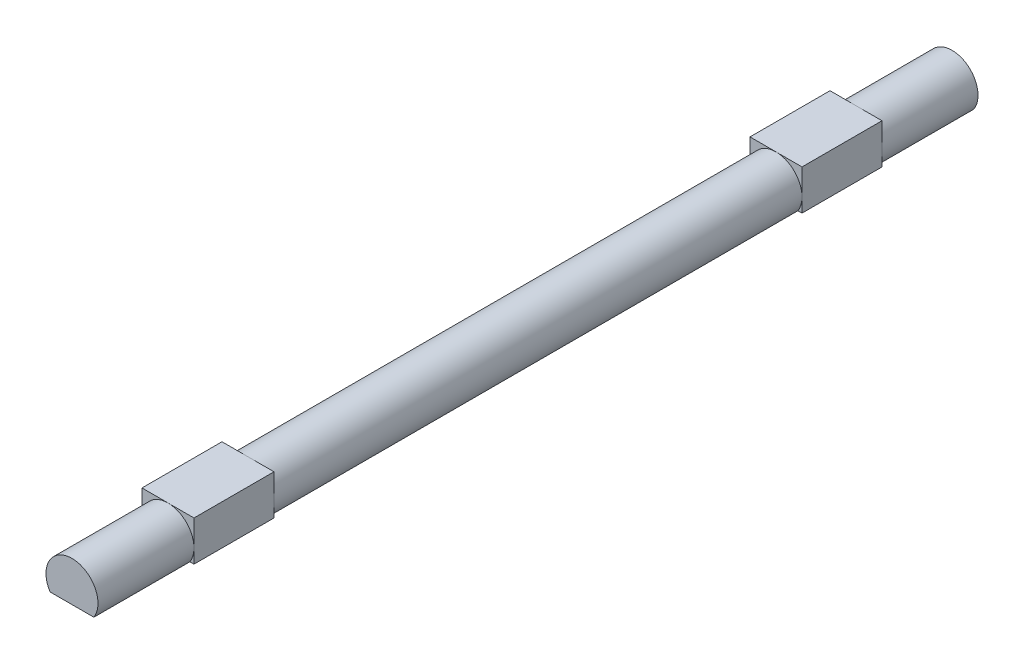
ISO-10303-21;
HEADER;
FILE_DESCRIPTION(('STEP AP214'),'2;1');
FILE_NAME('part.step','',(''),(''),'','','');
FILE_SCHEMA(('AUTOMOTIVE_DESIGN { 1 0 10303 214 1 1 1 1 }'));
ENDSEC;
DATA;
#1=APPLICATION_CONTEXT('core data for automotive mechanical design processes');
#2=APPLICATION_PROTOCOL_DEFINITION('international standard','automotive_design',2000,#1);
#3=PRODUCT_CONTEXT('',#1,'mechanical');
#4=PRODUCT('Part','Part','',(#3));
#5=PRODUCT_RELATED_PRODUCT_CATEGORY('part','',(#4));
#6=PRODUCT_DEFINITION_FORMATION('','',#4);
#7=PRODUCT_DEFINITION_CONTEXT('part definition',#1,'design');
#8=PRODUCT_DEFINITION('design','',#6,#7);
#9=PRODUCT_DEFINITION_SHAPE('','',#8);
#10=(LENGTH_UNIT() NAMED_UNIT(*) SI_UNIT(.MILLI.,.METRE.));
#11=(NAMED_UNIT(*) PLANE_ANGLE_UNIT() SI_UNIT($,.RADIAN.));
#12=(NAMED_UNIT(*) SI_UNIT($,.STERADIAN.) SOLID_ANGLE_UNIT());
#13=UNCERTAINTY_MEASURE_WITH_UNIT(LENGTH_MEASURE(1.E-05),#10,'distance_accuracy_value','');
#14=(GEOMETRIC_REPRESENTATION_CONTEXT(3) GLOBAL_UNCERTAINTY_ASSIGNED_CONTEXT((#13)) GLOBAL_UNIT_ASSIGNED_CONTEXT((#10,
#11,#12)) REPRESENTATION_CONTEXT('',''));
#15=CARTESIAN_POINT('',(0.,0.,0.));
#16=DIRECTION('',(0.,0.,1.));
#17=DIRECTION('',(1.,0.,0.));
#18=AXIS2_PLACEMENT_3D('',#15,#16,#17);
#19=CARTESIAN_POINT('',(28.2640151407488,5.,-55.));
#20=DIRECTION('',(0.,0.,1.));
#21=DIRECTION('',(1.,0.,0.));
#22=AXIS2_PLACEMENT_3D('',#19,#20,#21);
#23=CYLINDRICAL_SURFACE('',#22,3.25);
#24=CARTESIAN_POINT('',(28.2640151407488,5.,-33.));
#25=DIRECTION('',(0.,0.,-1.));
#26=DIRECTION('',(-1.,0.,0.));
#27=AXIS2_PLACEMENT_3D('',#24,#25,#26);
#28=CIRCLE('',#27,3.25);
#29=CARTESIAN_POINT('',(28.2640151407488,8.25,-33.));
#30=VERTEX_POINT('',#29);
#31=CARTESIAN_POINT('',(25.0140151407488,5.,-33.));
#32=VERTEX_POINT('',#31);
#33=EDGE_CURVE('E57',#30,#32,#28,.F.);
#34=ORIENTED_EDGE('',*,*,#33,.T.);
#35=CARTESIAN_POINT('',(25.528440088825,3.24525525067263,-33.));
#36=VERTEX_POINT('',#35);
#37=EDGE_CURVE('E234',#32,#36,#28,.F.);
#38=ORIENTED_EDGE('',*,*,#37,.T.);
#39=DIRECTION('',(0.,0.,1.));
#40=VECTOR('',#39,1.);
#41=CARTESIAN_POINT('',(25.528440088825,3.24525525067263,-55.));
#42=LINE('',#41,#40);
#43=CARTESIAN_POINT('',(25.528440088825,3.24525525067263,33.));
#44=VERTEX_POINT('',#43);
#45=EDGE_CURVE('E294',#36,#44,#42,.T.);
#46=ORIENTED_EDGE('',*,*,#45,.T.);
#47=CARTESIAN_POINT('',(28.2640151407488,5.,33.));
#48=DIRECTION('',(0.,0.,1.));
#49=DIRECTION('',(1.,0.,0.));
#50=AXIS2_PLACEMENT_3D('',#47,#48,#49);
#51=CIRCLE('',#50,3.25);
#52=CARTESIAN_POINT('',(25.0140151407488,5.,33.));
#53=VERTEX_POINT('',#52);
#54=EDGE_CURVE('E44',#44,#53,#51,.F.);
#55=ORIENTED_EDGE('',*,*,#54,.T.);
#56=CARTESIAN_POINT('',(28.2640151407488,8.25,33.));
#57=VERTEX_POINT('',#56);
#58=EDGE_CURVE('E308',#53,#57,#51,.F.);
#59=ORIENTED_EDGE('',*,*,#58,.T.);
#60=CARTESIAN_POINT('',(31.5140151407488,5.,33.));
#61=VERTEX_POINT('',#60);
#62=EDGE_CURVE('E39',#57,#61,#51,.F.);
#63=ORIENTED_EDGE('',*,*,#62,.T.);
#64=CARTESIAN_POINT('',(30.9995901926726,3.24525525067263,33.));
#65=VERTEX_POINT('',#64);
#66=EDGE_CURVE('E11',#61,#65,#51,.F.);
#67=ORIENTED_EDGE('',*,*,#66,.T.);
#68=DIRECTION('',(0.,0.,1.));
#69=VECTOR('',#68,1.);
#70=CARTESIAN_POINT('',(30.9995901926726,3.24525525067263,-55.));
#71=LINE('',#70,#69);
#72=CARTESIAN_POINT('',(30.9995901926726,3.24525525067263,-33.));
#73=VERTEX_POINT('',#72);
#74=EDGE_CURVE('E297',#73,#65,#71,.T.);
#75=ORIENTED_EDGE('',*,*,#74,.F.);
#76=CARTESIAN_POINT('',(31.5140151407488,5.,-33.));
#77=VERTEX_POINT('',#76);
#78=EDGE_CURVE('E51',#73,#77,#28,.F.);
#79=ORIENTED_EDGE('',*,*,#78,.T.);
#80=EDGE_CURVE('E233',#77,#30,#28,.F.);
#81=ORIENTED_EDGE('',*,*,#80,.T.);
#82=EDGE_LOOP('',(#34,#38,#46,#55,#59,#63,#67,#75,#79,#81));
#83=FACE_BOUND('',#82,.T.);
#84=ADVANCED_FACE('F35',(#83),#23,.T.);
#85=CARTESIAN_POINT('',(28.2640151407488,5.,-43.));
#86=DIRECTION('',(0.,0.,-1.));
#87=DIRECTION('',(-1.,0.,0.));
#88=AXIS2_PLACEMENT_3D('',#85,#86,#87);
#89=CIRCLE('',#88,3.25);
#90=CARTESIAN_POINT('',(25.0140151407488,5.,-43.));
#91=VERTEX_POINT('',#90);
#92=CARTESIAN_POINT('',(25.528440088825,3.24525525067263,-43.));
#93=VERTEX_POINT('',#92);
#94=EDGE_CURVE('E231',#91,#93,#89,.F.);
#95=ORIENTED_EDGE('',*,*,#94,.F.);
#96=CARTESIAN_POINT('',(28.2640151407488,8.25,-43.));
#97=VERTEX_POINT('',#96);
#98=EDGE_CURVE('E222',#97,#91,#89,.F.);
#99=ORIENTED_EDGE('',*,*,#98,.F.);
#100=CARTESIAN_POINT('',(31.5140151407488,5.,-43.));
#101=VERTEX_POINT('',#100);
#102=EDGE_CURVE('E230',#101,#97,#89,.F.);
#103=ORIENTED_EDGE('',*,*,#102,.F.);
#104=CARTESIAN_POINT('',(30.9995901926726,3.24525525067263,-43.));
#105=VERTEX_POINT('',#104);
#106=EDGE_CURVE('E356',#105,#101,#89,.F.);
#107=ORIENTED_EDGE('',*,*,#106,.F.);
#108=CARTESIAN_POINT('',(30.9995901926726,3.24525525067263,-55.));
#109=VERTEX_POINT('',#108);
#110=EDGE_CURVE('E296',#109,#105,#71,.T.);
#111=ORIENTED_EDGE('',*,*,#110,.F.);
#112=CARTESIAN_POINT('',(28.2640151407488,5.,-55.));
#113=DIRECTION('',(0.,0.,1.));
#114=DIRECTION('',(1.,0.,0.));
#115=AXIS2_PLACEMENT_3D('',#112,#113,#114);
#116=CIRCLE('',#115,3.25);
#117=CARTESIAN_POINT('',(25.528440088825,3.24525525067263,-55.));
#118=VERTEX_POINT('',#117);
#119=EDGE_CURVE('E287',#109,#118,#116,.T.);
#120=ORIENTED_EDGE('',*,*,#119,.T.);
#121=EDGE_CURVE('E291',#118,#93,#42,.T.);
#122=ORIENTED_EDGE('',*,*,#121,.T.);
#123=EDGE_LOOP('',(#95,#99,#103,#107,#111,#120,#122));
#124=FACE_BOUND('',#123,.T.);
#125=ADVANCED_FACE('F385',(#124),#23,.T.);
#126=CARTESIAN_POINT('',(0.,3.24525525067262,-55.));
#127=DIRECTION('',(0.,1.,0.));
#128=DIRECTION('',(-1.,0.,0.));
#129=AXIS2_PLACEMENT_3D('',#126,#127,#128);
#130=PLANE('',#129);
#131=ORIENTED_EDGE('',*,*,#110,.T.);
#132=DIRECTION('',(1.,0.,0.));
#133=VECTOR('',#132,1.);
#134=CARTESIAN_POINT('',(31.5140151407488,3.24525525067263,-43.));
#135=LINE('',#134,#133);
#136=CARTESIAN_POINT('',(31.5140151407488,3.24525525067263,-43.));
#137=VERTEX_POINT('',#136);
#138=EDGE_CURVE('E184',#105,#137,#135,.T.);
#139=ORIENTED_EDGE('',*,*,#138,.T.);
#140=DIRECTION('',(0.,0.,-1.));
#141=VECTOR('',#140,1.);
#142=CARTESIAN_POINT('',(31.5140151407488,3.24525525067263,-33.));
#143=LINE('',#142,#141);
#144=CARTESIAN_POINT('',(31.5140151407488,3.24525525067263,-33.));
#145=VERTEX_POINT('',#144);
#146=EDGE_CURVE('E181',#145,#137,#143,.T.);
#147=ORIENTED_EDGE('',*,*,#146,.F.);
#148=DIRECTION('',(1.,0.,0.));
#149=VECTOR('',#148,1.);
#150=CARTESIAN_POINT('',(31.5140151407488,3.24525525067263,-33.));
#151=LINE('',#150,#149);
#152=EDGE_CURVE('E172',#73,#145,#151,.T.);
#153=ORIENTED_EDGE('',*,*,#152,.F.);
#154=ORIENTED_EDGE('',*,*,#74,.T.);
#155=DIRECTION('',(1.,0.,0.));
#156=VECTOR('',#155,1.);
#157=CARTESIAN_POINT('',(31.5140151407488,3.24525525067263,33.));
#158=LINE('',#157,#156);
#159=CARTESIAN_POINT('',(31.5140151407488,3.24525525067263,33.));
#160=VERTEX_POINT('',#159);
#161=EDGE_CURVE('E247',#65,#160,#158,.T.);
#162=ORIENTED_EDGE('',*,*,#161,.T.);
#163=DIRECTION('',(0.,0.,1.));
#164=VECTOR('',#163,1.);
#165=CARTESIAN_POINT('',(31.5140151407488,3.24525525067263,33.));
#166=LINE('',#165,#164);
#167=CARTESIAN_POINT('',(31.5140151407488,3.24525525067263,43.));
#168=VERTEX_POINT('',#167);
#169=EDGE_CURVE('E268',#160,#168,#166,.T.);
#170=ORIENTED_EDGE('',*,*,#169,.T.);
#171=DIRECTION('',(1.,0.,0.));
#172=VECTOR('',#171,1.);
#173=CARTESIAN_POINT('',(31.5140151407488,3.24525525067263,43.));
#174=LINE('',#173,#172);
#175=CARTESIAN_POINT('',(30.9995901926726,3.24525525067263,43.));
#176=VERTEX_POINT('',#175);
#177=EDGE_CURVE('E264',#176,#168,#174,.T.);
#178=ORIENTED_EDGE('',*,*,#177,.F.);
#179=CARTESIAN_POINT('',(30.9995901926726,3.24525525067263,55.));
#180=VERTEX_POINT('',#179);
#181=EDGE_CURVE('E290',#176,#180,#71,.T.);
#182=ORIENTED_EDGE('',*,*,#181,.T.);
#183=DIRECTION('',(-1.,0.,0.));
#184=VECTOR('',#183,1.);
#185=CARTESIAN_POINT('',(0.,3.24525525067262,55.));
#186=LINE('',#185,#184);
#187=CARTESIAN_POINT('',(25.528440088825,3.24525525067263,55.));
#188=VERTEX_POINT('',#187);
#189=EDGE_CURVE('E271',#180,#188,#186,.T.);
#190=ORIENTED_EDGE('',*,*,#189,.T.);
#191=CARTESIAN_POINT('',(25.528440088825,3.24525525067263,43.));
#192=VERTEX_POINT('',#191);
#193=EDGE_CURVE('E295',#192,#188,#42,.T.);
#194=ORIENTED_EDGE('',*,*,#193,.F.);
#195=CARTESIAN_POINT('',(25.0140151407488,3.24525525067263,43.));
#196=VERTEX_POINT('',#195);
#197=EDGE_CURVE('E265',#196,#192,#174,.T.);
#198=ORIENTED_EDGE('',*,*,#197,.F.);
#199=DIRECTION('',(0.,0.,1.));
#200=VECTOR('',#199,1.);
#201=CARTESIAN_POINT('',(25.0140151407488,3.24525525067263,33.));
#202=LINE('',#201,#200);
#203=CARTESIAN_POINT('',(25.0140151407488,3.24525525067263,33.));
#204=VERTEX_POINT('',#203);
#205=EDGE_CURVE('E272',#204,#196,#202,.T.);
#206=ORIENTED_EDGE('',*,*,#205,.F.);
#207=EDGE_CURVE('E248',#204,#44,#158,.T.);
#208=ORIENTED_EDGE('',*,*,#207,.T.);
#209=ORIENTED_EDGE('',*,*,#45,.F.);
#210=CARTESIAN_POINT('',(25.0140151407488,3.24525525067263,-33.));
#211=VERTEX_POINT('',#210);
#212=EDGE_CURVE('E178',#211,#36,#151,.T.);
#213=ORIENTED_EDGE('',*,*,#212,.F.);
#214=DIRECTION('',(0.,0.,-1.));
#215=VECTOR('',#214,1.);
#216=CARTESIAN_POINT('',(25.0140151407488,3.24525525067263,-33.));
#217=LINE('',#216,#215);
#218=CARTESIAN_POINT('',(25.0140151407488,3.24525525067263,-43.));
#219=VERTEX_POINT('',#218);
#220=EDGE_CURVE('E188',#211,#219,#217,.T.);
#221=ORIENTED_EDGE('',*,*,#220,.T.);
#222=EDGE_CURVE('E209',#219,#93,#135,.T.);
#223=ORIENTED_EDGE('',*,*,#222,.T.);
#224=ORIENTED_EDGE('',*,*,#121,.F.);
#225=DIRECTION('',(-1.,0.,0.));
#226=VECTOR('',#225,1.);
#227=CARTESIAN_POINT('',(0.,3.24525525067262,-55.));
#228=LINE('',#227,#226);
#229=EDGE_CURVE('E285',#109,#118,#228,.T.);
#230=ORIENTED_EDGE('',*,*,#229,.F.);
#231=EDGE_LOOP('',(#131,#139,#147,#153,#154,#162,#170,#178,#182,#190,#194,#198,#206,#208,#209,
#213,#221,#223,#224,#230));
#232=FACE_BOUND('',#231,.T.);
#233=ADVANCED_FACE('F37',(#232),#130,.F.);
#234=CARTESIAN_POINT('',(28.2640151407488,5.,43.));
#235=DIRECTION('',(0.,0.,1.));
#236=DIRECTION('',(1.,0.,0.));
#237=AXIS2_PLACEMENT_3D('',#234,#235,#236);
#238=CIRCLE('',#237,3.25);
#239=CARTESIAN_POINT('',(31.5140151407488,5.,43.));
#240=VERTEX_POINT('',#239);
#241=EDGE_CURVE('E300',#240,#176,#238,.F.);
#242=ORIENTED_EDGE('',*,*,#241,.F.);
#243=CARTESIAN_POINT('',(28.2640151407488,8.25,43.));
#244=VERTEX_POINT('',#243);
#245=EDGE_CURVE('E293',#244,#240,#238,.F.);
#246=ORIENTED_EDGE('',*,*,#245,.F.);
#247=CARTESIAN_POINT('',(25.0140151407488,5.,43.));
#248=VERTEX_POINT('',#247);
#249=EDGE_CURVE('E299',#248,#244,#238,.F.);
#250=ORIENTED_EDGE('',*,*,#249,.F.);
#251=EDGE_CURVE('E304',#192,#248,#238,.F.);
#252=ORIENTED_EDGE('',*,*,#251,.F.);
#253=ORIENTED_EDGE('',*,*,#193,.T.);
#254=CARTESIAN_POINT('',(28.2640151407488,5.,55.));
#255=DIRECTION('',(0.,0.,1.));
#256=DIRECTION('',(1.,0.,0.));
#257=AXIS2_PLACEMENT_3D('',#254,#255,#256);
#258=CIRCLE('',#257,3.25);
#259=EDGE_CURVE('E282',#180,#188,#258,.T.);
#260=ORIENTED_EDGE('',*,*,#259,.F.);
#261=ORIENTED_EDGE('',*,*,#181,.F.);
#262=EDGE_LOOP('',(#242,#246,#250,#252,#253,#260,#261));
#263=FACE_BOUND('',#262,.T.);
#264=ADVANCED_FACE('F386',(#263),#23,.T.);
#265=CARTESIAN_POINT('',(0.,0.,-55.));
#266=DIRECTION('',(0.,0.,1.));
#267=DIRECTION('',(1.,0.,0.));
#268=AXIS2_PLACEMENT_3D('',#265,#266,#267);
#269=PLANE('',#268);
#270=ORIENTED_EDGE('',*,*,#229,.T.);
#271=ORIENTED_EDGE('',*,*,#119,.F.);
#272=EDGE_LOOP('',(#270,#271));
#273=FACE_BOUND('',#272,.T.);
#274=ADVANCED_FACE('F392',(#273),#269,.F.);
#275=CARTESIAN_POINT('',(0.,0.,55.));
#276=DIRECTION('',(0.,0.,1.));
#277=DIRECTION('',(1.,0.,0.));
#278=AXIS2_PLACEMENT_3D('',#275,#276,#277);
#279=PLANE('',#278);
#280=ORIENTED_EDGE('',*,*,#189,.F.);
#281=ORIENTED_EDGE('',*,*,#259,.T.);
#282=EDGE_LOOP('',(#280,#281));
#283=FACE_BOUND('',#282,.T.);
#284=ADVANCED_FACE('F397',(#283),#279,.T.);
#285=CARTESIAN_POINT('',(31.5140151407488,3.24525525067263,33.));
#286=DIRECTION('',(1.,0.,0.));
#287=DIRECTION('',(0.,0.,-1.));
#288=AXIS2_PLACEMENT_3D('',#285,#286,#287);
#289=PLANE('',#288);
#290=DIRECTION('',(0.,1.,0.));
#291=VECTOR('',#290,1.);
#292=CARTESIAN_POINT('',(31.5140151407488,3.24525525067263,33.));
#293=LINE('',#292,#291);
#294=EDGE_CURVE('E235',#160,#61,#293,.T.);
#295=ORIENTED_EDGE('',*,*,#294,.T.);
#296=CARTESIAN_POINT('',(31.5140151407488,8.25,33.));
#297=VERTEX_POINT('',#296);
#298=EDGE_CURVE('E239',#61,#297,#293,.T.);
#299=ORIENTED_EDGE('',*,*,#298,.T.);
#300=DIRECTION('',(0.,0.,1.));
#301=VECTOR('',#300,1.);
#302=CARTESIAN_POINT('',(31.5140151407488,8.25,33.));
#303=LINE('',#302,#301);
#304=CARTESIAN_POINT('',(31.5140151407488,8.25,43.));
#305=VERTEX_POINT('',#304);
#306=EDGE_CURVE('E251',#297,#305,#303,.T.);
#307=ORIENTED_EDGE('',*,*,#306,.T.);
#308=DIRECTION('',(0.,1.,0.));
#309=VECTOR('',#308,1.);
#310=CARTESIAN_POINT('',(31.5140151407488,3.24525525067263,43.));
#311=LINE('',#310,#309);
#312=EDGE_CURVE('E256',#240,#305,#311,.T.);
#313=ORIENTED_EDGE('',*,*,#312,.F.);
#314=EDGE_CURVE('E252',#168,#240,#311,.T.);
#315=ORIENTED_EDGE('',*,*,#314,.F.);
#316=ORIENTED_EDGE('',*,*,#169,.F.);
#317=EDGE_LOOP('',(#295,#299,#307,#313,#315,#316));
#318=FACE_BOUND('',#317,.T.);
#319=ADVANCED_FACE('F407',(#318),#289,.T.);
#320=CARTESIAN_POINT('',(25.0140151407488,3.24525525067263,33.));
#321=DIRECTION('',(-1.,0.,0.));
#322=DIRECTION('',(0.,0.,1.));
#323=AXIS2_PLACEMENT_3D('',#320,#321,#322);
#324=PLANE('',#323);
#325=DIRECTION('',(0.,-1.,0.));
#326=VECTOR('',#325,1.);
#327=CARTESIAN_POINT('',(25.0140151407488,3.24525525067263,33.));
#328=LINE('',#327,#326);
#329=CARTESIAN_POINT('',(25.0140151407488,8.25,33.));
#330=VERTEX_POINT('',#329);
#331=EDGE_CURVE('E244',#330,#53,#328,.T.);
#332=ORIENTED_EDGE('',*,*,#331,.T.);
#333=EDGE_CURVE('E243',#53,#204,#328,.T.);
#334=ORIENTED_EDGE('',*,*,#333,.T.);
#335=ORIENTED_EDGE('',*,*,#205,.T.);
#336=DIRECTION('',(0.,-1.,0.));
#337=VECTOR('',#336,1.);
#338=CARTESIAN_POINT('',(25.0140151407488,3.24525525067263,43.));
#339=LINE('',#338,#337);
#340=EDGE_CURVE('E260',#248,#196,#339,.T.);
#341=ORIENTED_EDGE('',*,*,#340,.F.);
#342=CARTESIAN_POINT('',(25.0140151407488,8.25,43.));
#343=VERTEX_POINT('',#342);
#344=EDGE_CURVE('E261',#343,#248,#339,.T.);
#345=ORIENTED_EDGE('',*,*,#344,.F.);
#346=DIRECTION('',(0.,0.,1.));
#347=VECTOR('',#346,1.);
#348=CARTESIAN_POINT('',(25.0140151407488,8.25,33.));
#349=LINE('',#348,#347);
#350=EDGE_CURVE('E275',#330,#343,#349,.T.);
#351=ORIENTED_EDGE('',*,*,#350,.F.);
#352=EDGE_LOOP('',(#332,#334,#335,#341,#345,#351));
#353=FACE_BOUND('',#352,.T.);
#354=ADVANCED_FACE('F318',(#353),#324,.T.);
#355=CARTESIAN_POINT('',(31.5140151407488,8.25,33.));
#356=DIRECTION('',(0.,1.,0.));
#357=DIRECTION('',(0.,0.,1.));
#358=AXIS2_PLACEMENT_3D('',#355,#356,#357);
#359=PLANE('',#358);
#360=DIRECTION('',(-1.,0.,0.));
#361=VECTOR('',#360,1.);
#362=CARTESIAN_POINT('',(31.5140151407488,8.25,33.));
#363=LINE('',#362,#361);
#364=EDGE_CURVE('E240',#297,#57,#363,.T.);
#365=ORIENTED_EDGE('',*,*,#364,.T.);
#366=EDGE_CURVE('E238',#57,#330,#363,.T.);
#367=ORIENTED_EDGE('',*,*,#366,.T.);
#368=ORIENTED_EDGE('',*,*,#350,.T.);
#369=DIRECTION('',(-1.,0.,0.));
#370=VECTOR('',#369,1.);
#371=CARTESIAN_POINT('',(31.5140151407488,8.25,43.));
#372=LINE('',#371,#370);
#373=EDGE_CURVE('E255',#244,#343,#372,.T.);
#374=ORIENTED_EDGE('',*,*,#373,.F.);
#375=EDGE_CURVE('E257',#305,#244,#372,.T.);
#376=ORIENTED_EDGE('',*,*,#375,.F.);
#377=ORIENTED_EDGE('',*,*,#306,.F.);
#378=EDGE_LOOP('',(#365,#367,#368,#374,#376,#377));
#379=FACE_BOUND('',#378,.T.);
#380=ADVANCED_FACE('F326',(#379),#359,.T.);
#381=CARTESIAN_POINT('',(0.,0.,33.));
#382=DIRECTION('',(0.,0.,1.));
#383=DIRECTION('',(1.,0.,0.));
#384=AXIS2_PLACEMENT_3D('',#381,#382,#383);
#385=PLANE('',#384);
#386=ORIENTED_EDGE('',*,*,#66,.F.);
#387=ORIENTED_EDGE('',*,*,#294,.F.);
#388=ORIENTED_EDGE('',*,*,#161,.F.);
#389=EDGE_LOOP('',(#386,#387,#388));
#390=FACE_BOUND('',#389,.T.);
#391=ADVANCED_FACE('F405',(#390),#385,.F.);
#392=ORIENTED_EDGE('',*,*,#54,.F.);
#393=ORIENTED_EDGE('',*,*,#207,.F.);
#394=ORIENTED_EDGE('',*,*,#333,.F.);
#395=EDGE_LOOP('',(#392,#393,#394));
#396=FACE_BOUND('',#395,.T.);
#397=ADVANCED_FACE('F337',(#396),#385,.F.);
#398=ORIENTED_EDGE('',*,*,#58,.F.);
#399=ORIENTED_EDGE('',*,*,#331,.F.);
#400=ORIENTED_EDGE('',*,*,#366,.F.);
#401=EDGE_LOOP('',(#398,#399,#400));
#402=FACE_BOUND('',#401,.T.);
#403=ADVANCED_FACE('F331',(#402),#385,.F.);
#404=CARTESIAN_POINT('',(0.,0.,43.));
#405=DIRECTION('',(0.,0.,1.));
#406=DIRECTION('',(1.,0.,0.));
#407=AXIS2_PLACEMENT_3D('',#404,#405,#406);
#408=PLANE('',#407);
#409=ORIENTED_EDGE('',*,*,#314,.T.);
#410=ORIENTED_EDGE('',*,*,#241,.T.);
#411=ORIENTED_EDGE('',*,*,#177,.T.);
#412=EDGE_LOOP('',(#409,#410,#411));
#413=FACE_BOUND('',#412,.T.);
#414=ADVANCED_FACE('F410',(#413),#408,.T.);
#415=ORIENTED_EDGE('',*,*,#197,.T.);
#416=ORIENTED_EDGE('',*,*,#251,.T.);
#417=ORIENTED_EDGE('',*,*,#340,.T.);
#418=EDGE_LOOP('',(#415,#416,#417));
#419=FACE_BOUND('',#418,.T.);
#420=ADVANCED_FACE('F312',(#419),#408,.T.);
#421=ORIENTED_EDGE('',*,*,#344,.T.);
#422=ORIENTED_EDGE('',*,*,#249,.T.);
#423=ORIENTED_EDGE('',*,*,#373,.T.);
#424=EDGE_LOOP('',(#421,#422,#423));
#425=FACE_BOUND('',#424,.T.);
#426=ADVANCED_FACE('F322',(#425),#408,.T.);
#427=ORIENTED_EDGE('',*,*,#62,.F.);
#428=ORIENTED_EDGE('',*,*,#364,.F.);
#429=ORIENTED_EDGE('',*,*,#298,.F.);
#430=EDGE_LOOP('',(#427,#428,#429));
#431=FACE_BOUND('',#430,.T.);
#432=ADVANCED_FACE('F419',(#431),#385,.F.);
#433=ORIENTED_EDGE('',*,*,#375,.T.);
#434=ORIENTED_EDGE('',*,*,#245,.T.);
#435=ORIENTED_EDGE('',*,*,#312,.T.);
#436=EDGE_LOOP('',(#433,#434,#435));
#437=FACE_BOUND('',#436,.T.);
#438=ADVANCED_FACE('F413',(#437),#408,.T.);
#439=CARTESIAN_POINT('',(31.5140151407488,3.24525525067263,-33.));
#440=DIRECTION('',(-1.,0.,0.));
#441=DIRECTION('',(0.,0.,1.));
#442=AXIS2_PLACEMENT_3D('',#439,#440,#441);
#443=PLANE('',#442);
#444=DIRECTION('',(0.,1.,0.));
#445=VECTOR('',#444,1.);
#446=CARTESIAN_POINT('',(31.5140151407488,3.24525525067263,-33.));
#447=LINE('',#446,#445);
#448=CARTESIAN_POINT('',(31.5140151407488,8.25,-33.));
#449=VERTEX_POINT('',#448);
#450=EDGE_CURVE('E194',#77,#449,#447,.T.);
#451=ORIENTED_EDGE('',*,*,#450,.F.);
#452=EDGE_CURVE('E176',#145,#77,#447,.T.);
#453=ORIENTED_EDGE('',*,*,#452,.F.);
#454=ORIENTED_EDGE('',*,*,#146,.T.);
#455=DIRECTION('',(0.,1.,0.));
#456=VECTOR('',#455,1.);
#457=CARTESIAN_POINT('',(31.5140151407488,3.24525525067263,-43.));
#458=LINE('',#457,#456);
#459=EDGE_CURVE('E206',#137,#101,#458,.T.);
#460=ORIENTED_EDGE('',*,*,#459,.T.);
#461=CARTESIAN_POINT('',(31.5140151407488,8.25,-43.));
#462=VERTEX_POINT('',#461);
#463=EDGE_CURVE('E208',#101,#462,#458,.T.);
#464=ORIENTED_EDGE('',*,*,#463,.T.);
#465=DIRECTION('',(0.,0.,-1.));
#466=VECTOR('',#465,1.);
#467=CARTESIAN_POINT('',(31.5140151407488,8.25,-33.));
#468=LINE('',#467,#466);
#469=EDGE_CURVE('E219',#449,#462,#468,.T.);
#470=ORIENTED_EDGE('',*,*,#469,.F.);
#471=EDGE_LOOP('',(#451,#453,#454,#460,#464,#470));
#472=FACE_BOUND('',#471,.T.);
#473=ADVANCED_FACE('F192',(#472),#443,.F.);
#474=CARTESIAN_POINT('',(31.5140151407488,8.25,-33.));
#475=DIRECTION('',(0.,-1.,0.));
#476=DIRECTION('',(0.,0.,-1.));
#477=AXIS2_PLACEMENT_3D('',#474,#475,#476);
#478=PLANE('',#477);
#479=DIRECTION('',(-1.,0.,0.));
#480=VECTOR('',#479,1.);
#481=CARTESIAN_POINT('',(31.5140151407488,8.25,-33.));
#482=LINE('',#481,#480);
#483=CARTESIAN_POINT('',(25.0140151407488,8.25,-33.));
#484=VERTEX_POINT('',#483);
#485=EDGE_CURVE('E203',#30,#484,#482,.T.);
#486=ORIENTED_EDGE('',*,*,#485,.F.);
#487=EDGE_CURVE('E189',#449,#30,#482,.T.);
#488=ORIENTED_EDGE('',*,*,#487,.F.);
#489=ORIENTED_EDGE('',*,*,#469,.T.);
#490=DIRECTION('',(-1.,0.,0.));
#491=VECTOR('',#490,1.);
#492=CARTESIAN_POINT('',(31.5140151407488,8.25,-43.));
#493=LINE('',#492,#491);
#494=EDGE_CURVE('E196',#462,#97,#493,.T.);
#495=ORIENTED_EDGE('',*,*,#494,.T.);
#496=CARTESIAN_POINT('',(25.0140151407488,8.25,-43.));
#497=VERTEX_POINT('',#496);
#498=EDGE_CURVE('E216',#97,#497,#493,.T.);
#499=ORIENTED_EDGE('',*,*,#498,.T.);
#500=DIRECTION('',(0.,0.,-1.));
#501=VECTOR('',#500,1.);
#502=CARTESIAN_POINT('',(25.0140151407488,8.25,-33.));
#503=LINE('',#502,#501);
#504=EDGE_CURVE('E223',#484,#497,#503,.T.);
#505=ORIENTED_EDGE('',*,*,#504,.F.);
#506=EDGE_LOOP('',(#486,#488,#489,#495,#499,#505));
#507=FACE_BOUND('',#506,.T.);
#508=ADVANCED_FACE('F371',(#507),#478,.F.);
#509=CARTESIAN_POINT('',(25.0140151407488,3.24525525067263,-33.));
#510=DIRECTION('',(1.,0.,0.));
#511=DIRECTION('',(0.,0.,-1.));
#512=AXIS2_PLACEMENT_3D('',#509,#510,#511);
#513=PLANE('',#512);
#514=DIRECTION('',(0.,-1.,0.));
#515=VECTOR('',#514,1.);
#516=CARTESIAN_POINT('',(25.0140151407488,3.24525525067263,-33.));
#517=LINE('',#516,#515);
#518=EDGE_CURVE('E199',#32,#211,#517,.T.);
#519=ORIENTED_EDGE('',*,*,#518,.F.);
#520=EDGE_CURVE('E200',#484,#32,#517,.T.);
#521=ORIENTED_EDGE('',*,*,#520,.F.);
#522=ORIENTED_EDGE('',*,*,#504,.T.);
#523=DIRECTION('',(0.,-1.,0.));
#524=VECTOR('',#523,1.);
#525=CARTESIAN_POINT('',(25.0140151407488,3.24525525067263,-43.));
#526=LINE('',#525,#524);
#527=EDGE_CURVE('E213',#497,#91,#526,.T.);
#528=ORIENTED_EDGE('',*,*,#527,.T.);
#529=EDGE_CURVE('E212',#91,#219,#526,.T.);
#530=ORIENTED_EDGE('',*,*,#529,.T.);
#531=ORIENTED_EDGE('',*,*,#220,.F.);
#532=EDGE_LOOP('',(#519,#521,#522,#528,#530,#531));
#533=FACE_BOUND('',#532,.T.);
#534=ADVANCED_FACE('F348',(#533),#513,.F.);
#535=CARTESIAN_POINT('',(0.,0.,-33.));
#536=DIRECTION('',(0.,0.,-1.));
#537=DIRECTION('',(1.,0.,0.));
#538=AXIS2_PLACEMENT_3D('',#535,#536,#537);
#539=PLANE('',#538);
#540=ORIENTED_EDGE('',*,*,#37,.F.);
#541=ORIENTED_EDGE('',*,*,#518,.T.);
#542=ORIENTED_EDGE('',*,*,#212,.T.);
#543=EDGE_LOOP('',(#540,#541,#542));
#544=FACE_BOUND('',#543,.T.);
#545=ADVANCED_FACE('F343',(#544),#539,.F.);
#546=ORIENTED_EDGE('',*,*,#78,.F.);
#547=ORIENTED_EDGE('',*,*,#152,.T.);
#548=ORIENTED_EDGE('',*,*,#452,.T.);
#549=EDGE_LOOP('',(#546,#547,#548));
#550=FACE_BOUND('',#549,.T.);
#551=ADVANCED_FACE('F174',(#550),#539,.F.);
#552=ORIENTED_EDGE('',*,*,#80,.F.);
#553=ORIENTED_EDGE('',*,*,#450,.T.);
#554=ORIENTED_EDGE('',*,*,#487,.T.);
#555=EDGE_LOOP('',(#552,#553,#554));
#556=FACE_BOUND('',#555,.T.);
#557=ADVANCED_FACE('F381',(#556),#539,.F.);
#558=CARTESIAN_POINT('',(0.,0.,-43.));
#559=DIRECTION('',(0.,0.,-1.));
#560=DIRECTION('',(1.,0.,0.));
#561=AXIS2_PLACEMENT_3D('',#558,#559,#560);
#562=PLANE('',#561);
#563=ORIENTED_EDGE('',*,*,#529,.F.);
#564=ORIENTED_EDGE('',*,*,#94,.T.);
#565=ORIENTED_EDGE('',*,*,#222,.F.);
#566=EDGE_LOOP('',(#563,#564,#565));
#567=FACE_BOUND('',#566,.T.);
#568=ADVANCED_FACE('F354',(#567),#562,.T.);
#569=ORIENTED_EDGE('',*,*,#138,.F.);
#570=ORIENTED_EDGE('',*,*,#106,.T.);
#571=ORIENTED_EDGE('',*,*,#459,.F.);
#572=EDGE_LOOP('',(#569,#570,#571));
#573=FACE_BOUND('',#572,.T.);
#574=ADVANCED_FACE('F373',(#573),#562,.T.);
#575=ORIENTED_EDGE('',*,*,#463,.F.);
#576=ORIENTED_EDGE('',*,*,#102,.T.);
#577=ORIENTED_EDGE('',*,*,#494,.F.);
#578=EDGE_LOOP('',(#575,#576,#577));
#579=FACE_BOUND('',#578,.T.);
#580=ADVANCED_FACE('F364',(#579),#562,.T.);
#581=ORIENTED_EDGE('',*,*,#33,.F.);
#582=ORIENTED_EDGE('',*,*,#485,.T.);
#583=ORIENTED_EDGE('',*,*,#520,.T.);
#584=EDGE_LOOP('',(#581,#582,#583));
#585=FACE_BOUND('',#584,.T.);
#586=ADVANCED_FACE('F380',(#585),#539,.F.);
#587=ORIENTED_EDGE('',*,*,#498,.F.);
#588=ORIENTED_EDGE('',*,*,#98,.T.);
#589=ORIENTED_EDGE('',*,*,#527,.F.);
#590=EDGE_LOOP('',(#587,#588,#589));
#591=FACE_BOUND('',#590,.T.);
#592=ADVANCED_FACE('F367',(#591),#562,.T.);
#593=CLOSED_SHELL('',(#84,#125,#233,#264,#274,#284,#319,#354,#380,#391,#397,#403,#414,#420,#426,
#432,#438,#473,#508,#534,#545,#551,#557,#568,#574,#580,#586,#592));
#594=MANIFOLD_SOLID_BREP('B2',#593);
#595=ADVANCED_BREP_SHAPE_REPRESENTATION('',(#18,#594),#14);
#596=SHAPE_DEFINITION_REPRESENTATION(#9,#595);
ENDSEC;
END-ISO-10303-21;
